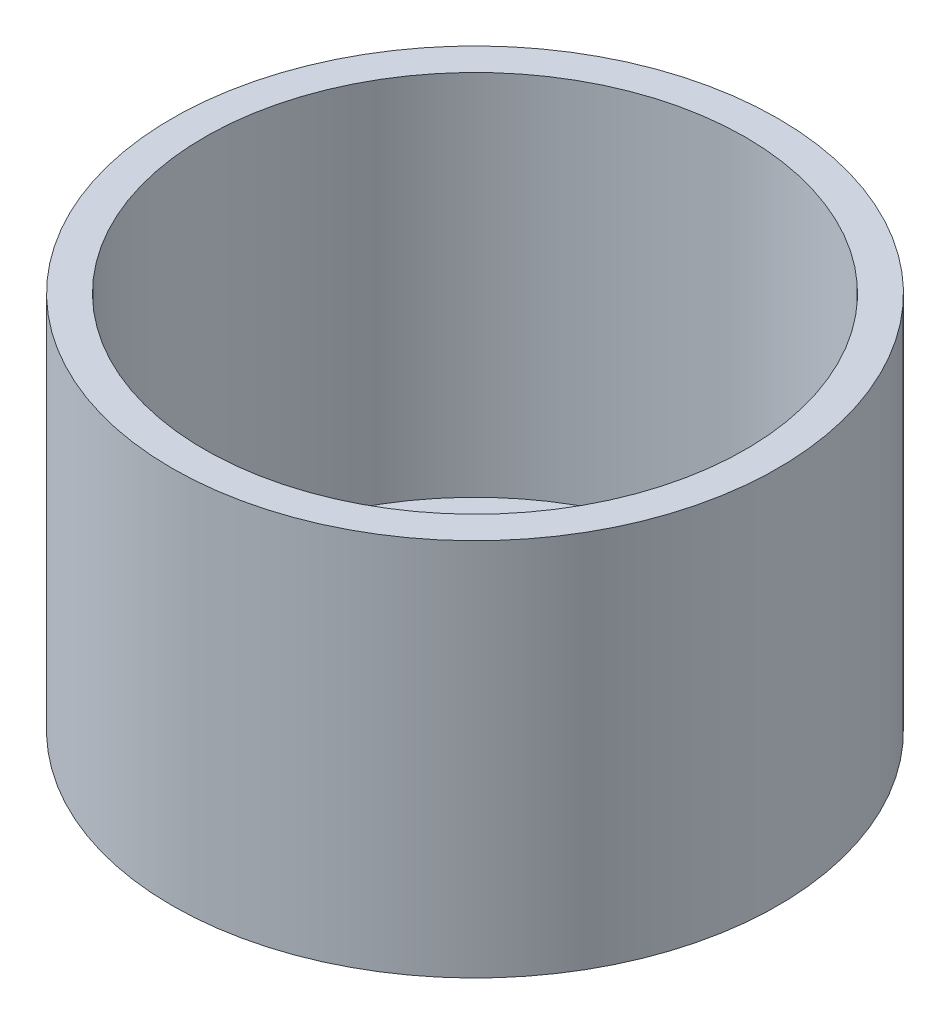
ISO-10303-21;
HEADER;
FILE_DESCRIPTION(('STEP AP214'),'2;1');
FILE_NAME('part.step','',(''),(''),'','','');
FILE_SCHEMA(('AUTOMOTIVE_DESIGN { 1 0 10303 214 1 1 1 1 }'));
ENDSEC;
DATA;
#1=APPLICATION_CONTEXT('core data for automotive mechanical design processes');
#2=APPLICATION_PROTOCOL_DEFINITION('international standard','automotive_design',2000,#1);
#3=PRODUCT_CONTEXT('',#1,'mechanical');
#4=PRODUCT('Part','Part','',(#3));
#5=PRODUCT_RELATED_PRODUCT_CATEGORY('part','',(#4));
#6=PRODUCT_DEFINITION_FORMATION('','',#4);
#7=PRODUCT_DEFINITION_CONTEXT('part definition',#1,'design');
#8=PRODUCT_DEFINITION('design','',#6,#7);
#9=PRODUCT_DEFINITION_SHAPE('','',#8);
#10=(LENGTH_UNIT() NAMED_UNIT(*) SI_UNIT(.MILLI.,.METRE.));
#11=(NAMED_UNIT(*) PLANE_ANGLE_UNIT() SI_UNIT($,.RADIAN.));
#12=(NAMED_UNIT(*) SI_UNIT($,.STERADIAN.) SOLID_ANGLE_UNIT());
#13=UNCERTAINTY_MEASURE_WITH_UNIT(LENGTH_MEASURE(1.E-05),#10,'distance_accuracy_value','');
#14=(GEOMETRIC_REPRESENTATION_CONTEXT(3) GLOBAL_UNCERTAINTY_ASSIGNED_CONTEXT((#13)) GLOBAL_UNIT_ASSIGNED_CONTEXT((#10,
#11,#12)) REPRESENTATION_CONTEXT('',''));
#15=CARTESIAN_POINT('',(0.,0.,0.));
#16=DIRECTION('',(0.,0.,1.));
#17=DIRECTION('',(1.,0.,0.));
#18=AXIS2_PLACEMENT_3D('',#15,#16,#17);
#19=CARTESIAN_POINT('',(0.,5.,0.));
#20=DIRECTION('',(0.,-1.,0.));
#21=DIRECTION('',(0.,0.,-1.));
#22=AXIS2_PLACEMENT_3D('',#19,#20,#21);
#23=PLANE('',#22);
#24=CARTESIAN_POINT('',(-9.23514045127996,5.,-58.4848506247052));
#25=DIRECTION('',(0.,1.,0.));
#26=DIRECTION('',(0.,0.,1.));
#27=AXIS2_PLACEMENT_3D('',#24,#25,#26);
#28=CIRCLE('',#27,2.5);
#29=CARTESIAN_POINT('',(-9.23514045127996,5.,-55.9848506247052));
#30=VERTEX_POINT('',#29);
#31=EDGE_CURVE('E68',#30,#30,#28,.T.);
#32=ORIENTED_EDGE('',*,*,#31,.F.);
#33=EDGE_LOOP('',(#32));
#34=FACE_BOUND('',#33,.T.);
#35=CARTESIAN_POINT('',(-47.5230041261087,5.,-40.2081032330678));
#36=DIRECTION('',(0.,1.,0.));
#37=DIRECTION('',(0.,0.,1.));
#38=AXIS2_PLACEMENT_3D('',#35,#36,#37);
#39=CIRCLE('',#38,2.5);
#40=CARTESIAN_POINT('',(-47.5230041261087,5.,-37.7081032330678));
#41=VERTEX_POINT('',#40);
#42=EDGE_CURVE('E58',#41,#41,#39,.T.);
#43=ORIENTED_EDGE('',*,*,#42,.F.);
#44=EDGE_LOOP('',(#43));
#45=FACE_BOUND('',#44,.T.);
#46=CARTESIAN_POINT('',(-37.5174459845131,5.,-68.4904087663009));
#47=DIRECTION('',(0.,1.,0.));
#48=DIRECTION('',(0.,0.,1.));
#49=AXIS2_PLACEMENT_3D('',#46,#47,#48);
#50=CIRCLE('',#49,2.5);
#51=CARTESIAN_POINT('',(-37.5174459845131,5.,-65.9904087663009));
#52=VERTEX_POINT('',#51);
#53=EDGE_CURVE('E55',#52,#52,#50,.T.);
#54=ORIENTED_EDGE('',*,*,#53,.F.);
#55=EDGE_LOOP('',(#54));
#56=FACE_BOUND('',#55,.T.);
#57=CARTESIAN_POINT('',(-19.2406985928756,5.,-30.2025450914721));
#58=DIRECTION('',(0.,1.,0.));
#59=DIRECTION('',(0.,0.,1.));
#60=AXIS2_PLACEMENT_3D('',#57,#58,#59);
#61=CIRCLE('',#60,2.49999999999999);
#62=CARTESIAN_POINT('',(-19.2406985928756,5.,-27.7025450914721));
#63=VERTEX_POINT('',#62);
#64=EDGE_CURVE('E52',#63,#63,#61,.T.);
#65=ORIENTED_EDGE('',*,*,#64,.F.);
#66=EDGE_LOOP('',(#65));
#67=FACE_BOUND('',#66,.T.);
#68=CARTESIAN_POINT('',(99.7789602785889,5.,1.14711804910892));
#69=DIRECTION('',(0.,-1.,0.));
#70=DIRECTION('',(0.,0.,-1.));
#71=AXIS2_PLACEMENT_3D('',#68,#69,#70);
#72=CIRCLE('',#71,9.5);
#73=CARTESIAN_POINT('',(99.7789602785889,5.,-8.35288195089108));
#74=VERTEX_POINT('',#73);
#75=EDGE_CURVE('E85',#74,#74,#72,.T.);
#76=ORIENTED_EDGE('',*,*,#75,.T.);
#77=EDGE_LOOP('',(#76));
#78=FACE_BOUND('',#77,.T.);
#79=CARTESIAN_POINT('',(-2.08832950931992E-13,5.,94.9999999999998));
#80=DIRECTION('',(0.,-1.,0.));
#81=DIRECTION('',(0.,0.,-1.));
#82=AXIS2_PLACEMENT_3D('',#79,#80,#81);
#83=CIRCLE('',#82,9.5);
#84=CARTESIAN_POINT('',(-2.08832950931992E-13,5.,85.4999999999998));
#85=VERTEX_POINT('',#84);
#86=EDGE_CURVE('E82',#85,#85,#83,.T.);
#87=ORIENTED_EDGE('',*,*,#86,.T.);
#88=EDGE_LOOP('',(#87));
#89=FACE_BOUND('',#88,.T.);
#90=CARTESIAN_POINT('',(0.,5.,0.));
#91=DIRECTION('',(0.,-1.,0.));
#92=DIRECTION('',(0.,0.,-1.));
#93=AXIS2_PLACEMENT_3D('',#90,#91,#92);
#94=CIRCLE('',#93,125.);
#95=CARTESIAN_POINT('',(0.,5.,-125.));
#96=VERTEX_POINT('',#95);
#97=EDGE_CURVE('E202',#96,#96,#94,.T.);
#98=ORIENTED_EDGE('',*,*,#97,.F.);
#99=EDGE_LOOP('',(#98));
#100=FACE_BOUND('',#99,.T.);
#101=ADVANCED_FACE('F31',(#34,#45,#56,#67,#78,#89,#100),#23,.F.);
#102=CARTESIAN_POINT('',(0.,0.,0.));
#103=DIRECTION('',(0.,-1.,0.));
#104=DIRECTION('',(0.,0.,-1.));
#105=AXIS2_PLACEMENT_3D('',#102,#103,#104);
#106=PLANE('',#105);
#107=CARTESIAN_POINT('',(-9.23514045127996,0.,-58.4848506247052));
#108=DIRECTION('',(0.,-1.,0.));
#109=DIRECTION('',(0.,0.,-1.));
#110=AXIS2_PLACEMENT_3D('',#107,#108,#109);
#111=CIRCLE('',#110,2.5);
#112=CARTESIAN_POINT('',(-9.23514045127996,0.,-60.9848506247052));
#113=VERTEX_POINT('',#112);
#114=EDGE_CURVE('E35',#113,#113,#111,.T.);
#115=ORIENTED_EDGE('',*,*,#114,.F.);
#116=EDGE_LOOP('',(#115));
#117=FACE_BOUND('',#116,.T.);
#118=CARTESIAN_POINT('',(-47.5230041261087,0.,-40.2081032330678));
#119=DIRECTION('',(0.,-1.,0.));
#120=DIRECTION('',(0.,0.,-1.));
#121=AXIS2_PLACEMENT_3D('',#118,#119,#120);
#122=CIRCLE('',#121,2.5);
#123=CARTESIAN_POINT('',(-47.5230041261087,0.,-42.7081032330678));
#124=VERTEX_POINT('',#123);
#125=EDGE_CURVE('E56',#124,#124,#122,.T.);
#126=ORIENTED_EDGE('',*,*,#125,.F.);
#127=EDGE_LOOP('',(#126));
#128=FACE_BOUND('',#127,.T.);
#129=CARTESIAN_POINT('',(-37.5174459845131,0.,-68.4904087663009));
#130=DIRECTION('',(0.,-1.,0.));
#131=DIRECTION('',(0.,0.,-1.));
#132=AXIS2_PLACEMENT_3D('',#129,#130,#131);
#133=CIRCLE('',#132,2.5);
#134=CARTESIAN_POINT('',(-37.5174459845131,0.,-70.9904087663009));
#135=VERTEX_POINT('',#134);
#136=EDGE_CURVE('E53',#135,#135,#133,.T.);
#137=ORIENTED_EDGE('',*,*,#136,.F.);
#138=EDGE_LOOP('',(#137));
#139=FACE_BOUND('',#138,.T.);
#140=CARTESIAN_POINT('',(-19.2406985928756,0.,-30.2025450914721));
#141=DIRECTION('',(0.,-1.,0.));
#142=DIRECTION('',(0.,0.,-1.));
#143=AXIS2_PLACEMENT_3D('',#140,#141,#142);
#144=CIRCLE('',#143,2.49999999999999);
#145=CARTESIAN_POINT('',(-19.2406985928756,0.,-32.7025450914721));
#146=VERTEX_POINT('',#145);
#147=EDGE_CURVE('E48',#146,#146,#144,.T.);
#148=ORIENTED_EDGE('',*,*,#147,.F.);
#149=EDGE_LOOP('',(#148));
#150=FACE_BOUND('',#149,.T.);
#151=CARTESIAN_POINT('',(0.,0.,0.));
#152=DIRECTION('',(0.,-1.,0.));
#153=DIRECTION('',(0.,0.,-1.));
#154=AXIS2_PLACEMENT_3D('',#151,#152,#153);
#155=CIRCLE('',#154,140.);
#156=CARTESIAN_POINT('',(0.,0.,-140.));
#157=VERTEX_POINT('',#156);
#158=EDGE_CURVE('E207',#157,#157,#155,.T.);
#159=ORIENTED_EDGE('',*,*,#158,.T.);
#160=EDGE_LOOP('',(#159));
#161=FACE_BOUND('',#160,.T.);
#162=ADVANCED_FACE('F128',(#117,#128,#139,#150,#161),#106,.T.);
#163=CARTESIAN_POINT('',(99.7789602785889,10.,1.14711804910892));
#164=DIRECTION('',(0.,-1.,0.));
#165=DIRECTION('',(0.,0.,-1.));
#166=AXIS2_PLACEMENT_3D('',#163,#164,#165);
#167=CYLINDRICAL_SURFACE('',#166,7.5);
#168=CARTESIAN_POINT('',(99.7789602785889,9.5,1.14711804910892));
#169=DIRECTION('',(0.,1.,0.));
#170=DIRECTION('',(0.,0.,1.));
#171=AXIS2_PLACEMENT_3D('',#168,#169,#170);
#172=CIRCLE('',#171,7.5);
#173=CARTESIAN_POINT('',(99.7789602785889,9.5,8.64711804910892));
#174=VERTEX_POINT('',#173);
#175=EDGE_CURVE('E44',#174,#174,#172,.F.);
#176=ORIENTED_EDGE('',*,*,#175,.T.);
#177=EDGE_LOOP('',(#176));
#178=FACE_BOUND('',#177,.T.);
#179=CARTESIAN_POINT('',(99.7789602785889,7.,1.14711804910892));
#180=DIRECTION('',(0.,-1.,0.));
#181=DIRECTION('',(0.,0.,-1.));
#182=AXIS2_PLACEMENT_3D('',#179,#180,#181);
#183=CIRCLE('',#182,7.5);
#184=CARTESIAN_POINT('',(99.7789602785889,7.,-6.35288195089108));
#185=VERTEX_POINT('',#184);
#186=EDGE_CURVE('E77',#185,#185,#183,.F.);
#187=ORIENTED_EDGE('',*,*,#186,.T.);
#188=EDGE_LOOP('',(#187));
#189=FACE_BOUND('',#188,.T.);
#190=ADVANCED_FACE('F96',(#178,#189),#167,.T.);
#191=CARTESIAN_POINT('',(99.7789602785889,10.,1.14711804910892));
#192=DIRECTION('',(0.,1.,0.));
#193=DIRECTION('',(0.,0.,1.));
#194=AXIS2_PLACEMENT_3D('',#191,#192,#193);
#195=PLANE('',#194);
#196=CARTESIAN_POINT('',(99.7789602785889,10.,1.14711804910892));
#197=DIRECTION('',(0.,1.,0.));
#198=DIRECTION('',(0.,0.,1.));
#199=AXIS2_PLACEMENT_3D('',#196,#197,#198);
#200=CIRCLE('',#199,7.);
#201=CARTESIAN_POINT('',(99.7789602785889,10.,8.14711804910892));
#202=VERTEX_POINT('',#201);
#203=EDGE_CURVE('E91',#202,#202,#200,.T.);
#204=ORIENTED_EDGE('',*,*,#203,.T.);
#205=EDGE_LOOP('',(#204));
#206=FACE_BOUND('',#205,.T.);
#207=CARTESIAN_POINT('',(99.7789602785889,10.,1.05000000000002));
#208=DIRECTION('',(0.,1.,0.));
#209=DIRECTION('',(0.,0.,1.));
#210=AXIS2_PLACEMENT_3D('',#207,#208,#209);
#211=CIRCLE('',#210,5.);
#212=CARTESIAN_POINT('',(99.7789602785889,10.,6.05000000000003));
#213=VERTEX_POINT('',#212);
#214=EDGE_CURVE('E51',#213,#213,#211,.T.);
#215=ORIENTED_EDGE('',*,*,#214,.F.);
#216=EDGE_LOOP('',(#215));
#217=FACE_BOUND('',#216,.T.);
#218=ADVANCED_FACE('F105',(#206,#217),#195,.T.);
#219=CARTESIAN_POINT('',(-2.08832950931992E-13,10.,94.9999999999998));
#220=DIRECTION('',(0.,-1.,0.));
#221=DIRECTION('',(0.,0.,-1.));
#222=AXIS2_PLACEMENT_3D('',#219,#220,#221);
#223=CYLINDRICAL_SURFACE('',#222,7.5);
#224=CARTESIAN_POINT('',(-2.08832950931992E-13,9.5,94.9999999999998));
#225=DIRECTION('',(0.,1.,0.));
#226=DIRECTION('',(0.,0.,1.));
#227=AXIS2_PLACEMENT_3D('',#224,#225,#226);
#228=CIRCLE('',#227,7.5);
#229=CARTESIAN_POINT('',(-2.08832950931992E-13,9.5,102.5));
#230=VERTEX_POINT('',#229);
#231=EDGE_CURVE('E11',#230,#230,#228,.F.);
#232=ORIENTED_EDGE('',*,*,#231,.T.);
#233=EDGE_LOOP('',(#232));
#234=FACE_BOUND('',#233,.T.);
#235=CARTESIAN_POINT('',(-2.08832950931992E-13,7.,94.9999999999998));
#236=DIRECTION('',(0.,-1.,0.));
#237=DIRECTION('',(0.,0.,-1.));
#238=AXIS2_PLACEMENT_3D('',#235,#236,#237);
#239=CIRCLE('',#238,7.5);
#240=CARTESIAN_POINT('',(-2.08832950931992E-13,7.,87.4999999999998));
#241=VERTEX_POINT('',#240);
#242=EDGE_CURVE('E88',#241,#241,#239,.F.);
#243=ORIENTED_EDGE('',*,*,#242,.T.);
#244=EDGE_LOOP('',(#243));
#245=FACE_BOUND('',#244,.T.);
#246=ADVANCED_FACE('F108',(#234,#245),#223,.T.);
#247=CARTESIAN_POINT('',(-2.08832950931992E-13,10.,94.9999999999998));
#248=DIRECTION('',(0.,1.,0.));
#249=DIRECTION('',(0.,0.,1.));
#250=AXIS2_PLACEMENT_3D('',#247,#248,#249);
#251=PLANE('',#250);
#252=CARTESIAN_POINT('',(-2.08832950931992E-13,10.,94.9999999999998));
#253=DIRECTION('',(0.,1.,0.));
#254=DIRECTION('',(0.,0.,1.));
#255=AXIS2_PLACEMENT_3D('',#252,#253,#254);
#256=CIRCLE('',#255,7.);
#257=CARTESIAN_POINT('',(-2.08832950931992E-13,10.,102.));
#258=VERTEX_POINT('',#257);
#259=EDGE_CURVE('E39',#258,#258,#256,.T.);
#260=ORIENTED_EDGE('',*,*,#259,.T.);
#261=EDGE_LOOP('',(#260));
#262=FACE_BOUND('',#261,.T.);
#263=CARTESIAN_POINT('',(0.,10.,94.9999999999998));
#264=DIRECTION('',(0.,1.,0.));
#265=DIRECTION('',(0.,0.,1.));
#266=AXIS2_PLACEMENT_3D('',#263,#264,#265);
#267=CIRCLE('',#266,5.);
#268=CARTESIAN_POINT('',(0.,10.,99.9999999999998));
#269=VERTEX_POINT('',#268);
#270=EDGE_CURVE('E74',#269,#269,#267,.T.);
#271=ORIENTED_EDGE('',*,*,#270,.F.);
#272=EDGE_LOOP('',(#271));
#273=FACE_BOUND('',#272,.T.);
#274=ADVANCED_FACE('F123',(#262,#273),#251,.T.);
#275=CARTESIAN_POINT('',(0.,10.,94.9999999999998));
#276=DIRECTION('',(0.,1.,0.));
#277=DIRECTION('',(0.,0.,-1.));
#278=AXIS2_PLACEMENT_3D('',#275,#276,#277);
#279=SPHERICAL_SURFACE('',#278,5.);
#280=ORIENTED_EDGE('',*,*,#270,.T.);
#281=EDGE_LOOP('',(#280));
#282=FACE_BOUND('',#281,.T.);
#283=ADVANCED_FACE('F115',(#282),#279,.F.);
#284=CARTESIAN_POINT('',(99.7789602785889,10.,1.05000000000002));
#285=DIRECTION('',(0.,1.,0.));
#286=DIRECTION('',(1.,0.,0.));
#287=AXIS2_PLACEMENT_3D('',#284,#285,#286);
#288=SPHERICAL_SURFACE('',#287,5.);
#289=ORIENTED_EDGE('',*,*,#214,.T.);
#290=EDGE_LOOP('',(#289));
#291=FACE_BOUND('',#290,.T.);
#292=ADVANCED_FACE('F112',(#291),#288,.F.);
#293=CARTESIAN_POINT('',(99.7789602785889,7.,1.14711804910892));
#294=DIRECTION('',(0.,-1.,0.));
#295=DIRECTION('',(0.,0.,-1.));
#296=AXIS2_PLACEMENT_3D('',#293,#294,#295);
#297=TOROIDAL_SURFACE('',#296,9.5,2.);
#298=ORIENTED_EDGE('',*,*,#75,.F.);
#299=EDGE_LOOP('',(#298));
#300=FACE_BOUND('',#299,.T.);
#301=ORIENTED_EDGE('',*,*,#186,.F.);
#302=EDGE_LOOP('',(#301));
#303=FACE_BOUND('',#302,.T.);
#304=ADVANCED_FACE('F114',(#300,#303),#297,.F.);
#305=CARTESIAN_POINT('',(-2.08832950931992E-13,7.,94.9999999999998));
#306=DIRECTION('',(0.,-1.,0.));
#307=DIRECTION('',(0.,0.,-1.));
#308=AXIS2_PLACEMENT_3D('',#305,#306,#307);
#309=TOROIDAL_SURFACE('',#308,9.5,2.);
#310=ORIENTED_EDGE('',*,*,#86,.F.);
#311=EDGE_LOOP('',(#310));
#312=FACE_BOUND('',#311,.T.);
#313=ORIENTED_EDGE('',*,*,#242,.F.);
#314=EDGE_LOOP('',(#313));
#315=FACE_BOUND('',#314,.T.);
#316=ADVANCED_FACE('F102',(#312,#315),#309,.F.);
#317=CARTESIAN_POINT('',(99.7789602785889,9.5,1.14711804910892));
#318=DIRECTION('',(0.,1.,0.));
#319=DIRECTION('',(0.,0.,1.));
#320=AXIS2_PLACEMENT_3D('',#317,#318,#319);
#321=TOROIDAL_SURFACE('',#320,7.,0.5);
#322=ORIENTED_EDGE('',*,*,#175,.F.);
#323=EDGE_LOOP('',(#322));
#324=FACE_BOUND('',#323,.T.);
#325=ORIENTED_EDGE('',*,*,#203,.F.);
#326=EDGE_LOOP('',(#325));
#327=FACE_BOUND('',#326,.T.);
#328=ADVANCED_FACE('F99',(#324,#327),#321,.T.);
#329=CARTESIAN_POINT('',(-2.08832950931992E-13,9.5,94.9999999999998));
#330=DIRECTION('',(0.,1.,0.));
#331=DIRECTION('',(0.,0.,1.));
#332=AXIS2_PLACEMENT_3D('',#329,#330,#331);
#333=TOROIDAL_SURFACE('',#332,7.,0.5);
#334=ORIENTED_EDGE('',*,*,#231,.F.);
#335=EDGE_LOOP('',(#334));
#336=FACE_BOUND('',#335,.T.);
#337=ORIENTED_EDGE('',*,*,#259,.F.);
#338=EDGE_LOOP('',(#337));
#339=FACE_BOUND('',#338,.T.);
#340=ADVANCED_FACE('F33',(#336,#339),#333,.T.);
#341=CARTESIAN_POINT('',(-19.2406985928756,-5.,-30.2025450914721));
#342=DIRECTION('',(0.,1.,0.));
#343=DIRECTION('',(0.,0.,1.));
#344=AXIS2_PLACEMENT_3D('',#341,#342,#343);
#345=CYLINDRICAL_SURFACE('',#344,2.49999999999999);
#346=ORIENTED_EDGE('',*,*,#147,.T.);
#347=EDGE_LOOP('',(#346));
#348=FACE_BOUND('',#347,.T.);
#349=ORIENTED_EDGE('',*,*,#64,.T.);
#350=EDGE_LOOP('',(#349));
#351=FACE_BOUND('',#350,.T.);
#352=ADVANCED_FACE('F162',(#348,#351),#345,.F.);
#353=CARTESIAN_POINT('',(-37.5174459845131,-5.,-68.4904087663009));
#354=DIRECTION('',(0.,1.,0.));
#355=DIRECTION('',(0.,0.,1.));
#356=AXIS2_PLACEMENT_3D('',#353,#354,#355);
#357=CYLINDRICAL_SURFACE('',#356,2.5);
#358=ORIENTED_EDGE('',*,*,#136,.T.);
#359=EDGE_LOOP('',(#358));
#360=FACE_BOUND('',#359,.T.);
#361=ORIENTED_EDGE('',*,*,#53,.T.);
#362=EDGE_LOOP('',(#361));
#363=FACE_BOUND('',#362,.T.);
#364=ADVANCED_FACE('F167',(#360,#363),#357,.F.);
#365=CARTESIAN_POINT('',(-47.5230041261087,-5.,-40.2081032330678));
#366=DIRECTION('',(0.,1.,0.));
#367=DIRECTION('',(0.,0.,1.));
#368=AXIS2_PLACEMENT_3D('',#365,#366,#367);
#369=CYLINDRICAL_SURFACE('',#368,2.5);
#370=ORIENTED_EDGE('',*,*,#125,.T.);
#371=EDGE_LOOP('',(#370));
#372=FACE_BOUND('',#371,.T.);
#373=ORIENTED_EDGE('',*,*,#42,.T.);
#374=EDGE_LOOP('',(#373));
#375=FACE_BOUND('',#374,.T.);
#376=ADVANCED_FACE('F172',(#372,#375),#369,.F.);
#377=CARTESIAN_POINT('',(-9.23514045127996,-5.,-58.4848506247052));
#378=DIRECTION('',(0.,1.,0.));
#379=DIRECTION('',(0.,0.,1.));
#380=AXIS2_PLACEMENT_3D('',#377,#378,#379);
#381=CYLINDRICAL_SURFACE('',#380,2.5);
#382=ORIENTED_EDGE('',*,*,#114,.T.);
#383=EDGE_LOOP('',(#382));
#384=FACE_BOUND('',#383,.T.);
#385=ORIENTED_EDGE('',*,*,#31,.T.);
#386=EDGE_LOOP('',(#385));
#387=FACE_BOUND('',#386,.T.);
#388=ADVANCED_FACE('F179',(#384,#387),#381,.F.);
#389=CARTESIAN_POINT('',(0.,175.,0.));
#390=DIRECTION('',(0.,-1.,0.));
#391=DIRECTION('',(0.,0.,-1.));
#392=AXIS2_PLACEMENT_3D('',#389,#390,#391);
#393=CYLINDRICAL_SURFACE('',#392,125.);
#394=CARTESIAN_POINT('',(0.,175.,0.));
#395=DIRECTION('',(0.,-1.,0.));
#396=DIRECTION('',(0.,0.,-1.));
#397=AXIS2_PLACEMENT_3D('',#394,#395,#396);
#398=CIRCLE('',#397,125.);
#399=CARTESIAN_POINT('',(0.,175.,-125.));
#400=VERTEX_POINT('',#399);
#401=EDGE_CURVE('E199',#400,#400,#398,.T.);
#402=ORIENTED_EDGE('',*,*,#401,.F.);
#403=EDGE_LOOP('',(#402));
#404=FACE_BOUND('',#403,.T.);
#405=ORIENTED_EDGE('',*,*,#97,.T.);
#406=EDGE_LOOP('',(#405));
#407=FACE_BOUND('',#406,.T.);
#408=ADVANCED_FACE('F182',(#404,#407),#393,.F.);
#409=CARTESIAN_POINT('',(0.,175.,0.));
#410=DIRECTION('',(0.,-1.,0.));
#411=DIRECTION('',(0.,0.,-1.));
#412=AXIS2_PLACEMENT_3D('',#409,#410,#411);
#413=CYLINDRICAL_SURFACE('',#412,140.);
#414=CARTESIAN_POINT('',(0.,175.,0.));
#415=DIRECTION('',(0.,-1.,0.));
#416=DIRECTION('',(0.,0.,-1.));
#417=AXIS2_PLACEMENT_3D('',#414,#415,#416);
#418=CIRCLE('',#417,140.);
#419=CARTESIAN_POINT('',(0.,175.,-140.));
#420=VERTEX_POINT('',#419);
#421=EDGE_CURVE('E204',#420,#420,#418,.T.);
#422=ORIENTED_EDGE('',*,*,#421,.T.);
#423=EDGE_LOOP('',(#422));
#424=FACE_BOUND('',#423,.T.);
#425=ORIENTED_EDGE('',*,*,#158,.F.);
#426=EDGE_LOOP('',(#425));
#427=FACE_BOUND('',#426,.T.);
#428=ADVANCED_FACE('F184',(#424,#427),#413,.T.);
#429=CARTESIAN_POINT('',(0.,175.,0.));
#430=DIRECTION('',(0.,-1.,0.));
#431=DIRECTION('',(0.,0.,-1.));
#432=AXIS2_PLACEMENT_3D('',#429,#430,#431);
#433=PLANE('',#432);
#434=ORIENTED_EDGE('',*,*,#401,.T.);
#435=EDGE_LOOP('',(#434));
#436=FACE_BOUND('',#435,.T.);
#437=ORIENTED_EDGE('',*,*,#421,.F.);
#438=EDGE_LOOP('',(#437));
#439=FACE_BOUND('',#438,.T.);
#440=ADVANCED_FACE('F187',(#436,#439),#433,.F.);
#441=CLOSED_SHELL('',(#101,#162,#190,#218,#246,#274,#283,#292,#304,#316,#328,#340,#352,#364,
#376,#388,#408,#428,#440));
#442=MANIFOLD_SOLID_BREP('B2',#441);
#443=ADVANCED_BREP_SHAPE_REPRESENTATION('',(#18,#442),#14);
#444=SHAPE_DEFINITION_REPRESENTATION(#9,#443);
ENDSEC;
END-ISO-10303-21;
